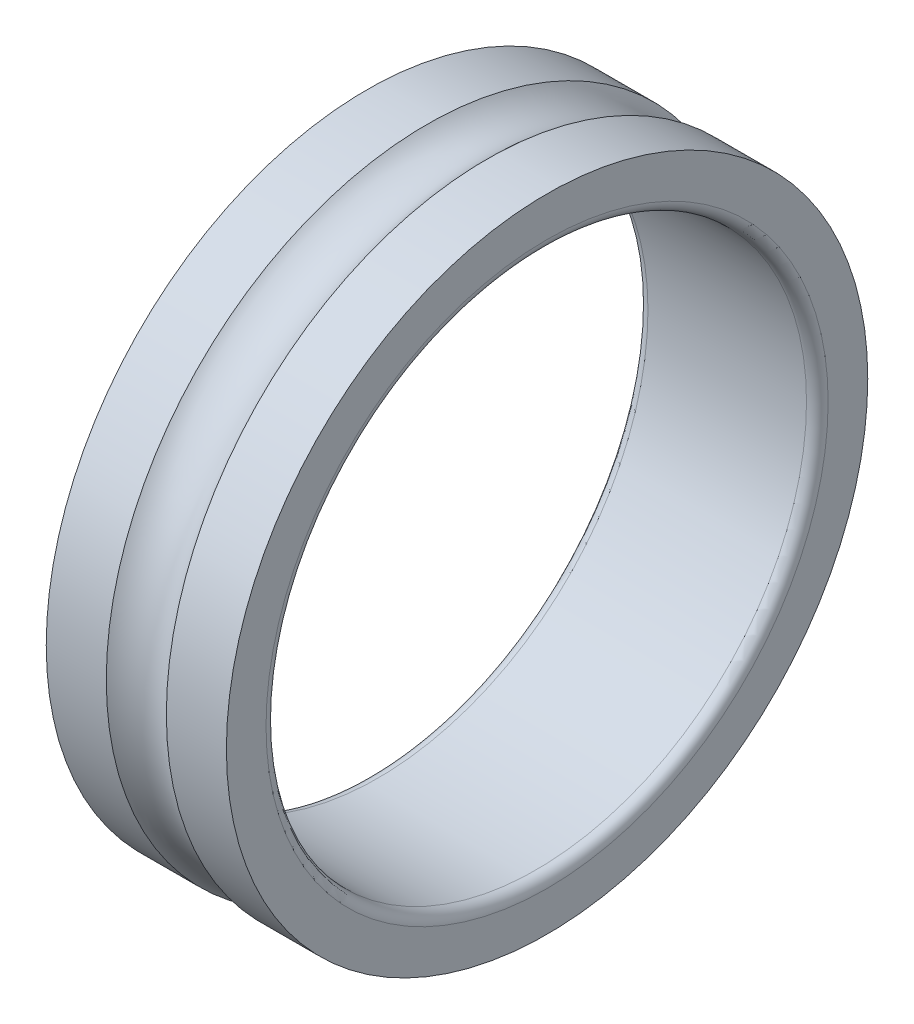
ISO-10303-21;
HEADER;
FILE_DESCRIPTION(('STEP AP214'),'2;1');
FILE_NAME('part.step','',(''),(''),'','','');
FILE_SCHEMA(('AUTOMOTIVE_DESIGN { 1 0 10303 214 1 1 1 1 }'));
ENDSEC;
DATA;
#1=APPLICATION_CONTEXT('core data for automotive mechanical design processes');
#2=APPLICATION_PROTOCOL_DEFINITION('international standard','automotive_design',2000,#1);
#3=PRODUCT_CONTEXT('',#1,'mechanical');
#4=PRODUCT('Part','Part','',(#3));
#5=PRODUCT_RELATED_PRODUCT_CATEGORY('part','',(#4));
#6=PRODUCT_DEFINITION_FORMATION('','',#4);
#7=PRODUCT_DEFINITION_CONTEXT('part definition',#1,'design');
#8=PRODUCT_DEFINITION('design','',#6,#7);
#9=PRODUCT_DEFINITION_SHAPE('','',#8);
#10=(LENGTH_UNIT() NAMED_UNIT(*) SI_UNIT(.MILLI.,.METRE.));
#11=(NAMED_UNIT(*) PLANE_ANGLE_UNIT() SI_UNIT($,.RADIAN.));
#12=(NAMED_UNIT(*) SI_UNIT($,.STERADIAN.) SOLID_ANGLE_UNIT());
#13=UNCERTAINTY_MEASURE_WITH_UNIT(LENGTH_MEASURE(1.E-05),#10,'distance_accuracy_value','');
#14=(GEOMETRIC_REPRESENTATION_CONTEXT(3) GLOBAL_UNCERTAINTY_ASSIGNED_CONTEXT((#13)) GLOBAL_UNIT_ASSIGNED_CONTEXT((#10,
#11,#12)) REPRESENTATION_CONTEXT('',''));
#15=CARTESIAN_POINT('',(0.,0.,0.));
#16=DIRECTION('',(0.,0.,1.));
#17=DIRECTION('',(1.,0.,0.));
#18=AXIS2_PLACEMENT_3D('',#15,#16,#17);
#19=CARTESIAN_POINT('',(0.299999999999939,0.,0.));
#20=DIRECTION('',(-1.,0.,0.));
#21=DIRECTION('',(0.,0.,1.));
#22=AXIS2_PLACEMENT_3D('',#19,#20,#21);
#23=TOROIDAL_SURFACE('',#22,7.79999999999994,0.299999999999939);
#24=CARTESIAN_POINT('',(0.300000000000002,0.,0.));
#25=DIRECTION('',(-1.,0.,0.));
#26=DIRECTION('',(0.,0.,1.));
#27=AXIS2_PLACEMENT_3D('',#24,#25,#26);
#28=CIRCLE('',#27,7.5);
#29=CARTESIAN_POINT('',(0.300000000000002,0.,7.5));
#30=VERTEX_POINT('',#29);
#31=EDGE_CURVE('E10',#30,#30,#28,.T.);
#32=ORIENTED_EDGE('',*,*,#31,.F.);
#33=EDGE_LOOP('',(#32));
#34=FACE_BOUND('',#33,.T.);
#35=CARTESIAN_POINT('',(0.,0.,0.));
#36=DIRECTION('',(-1.,0.,0.));
#37=DIRECTION('',(0.,0.,1.));
#38=AXIS2_PLACEMENT_3D('',#35,#36,#37);
#39=CIRCLE('',#38,7.8);
#40=CARTESIAN_POINT('',(0.,0.,7.8));
#41=VERTEX_POINT('',#40);
#42=EDGE_CURVE('E63',#41,#41,#39,.T.);
#43=ORIENTED_EDGE('',*,*,#42,.T.);
#44=EDGE_LOOP('',(#43));
#45=FACE_BOUND('',#44,.T.);
#46=ADVANCED_FACE('F35',(#34,#45),#23,.T.);
#47=CARTESIAN_POINT('',(50.,0.,0.));
#48=DIRECTION('',(-1.,0.,0.));
#49=DIRECTION('',(0.,0.,1.));
#50=AXIS2_PLACEMENT_3D('',#47,#48,#49);
#51=CYLINDRICAL_SURFACE('',#50,7.5);
#52=CARTESIAN_POINT('',(4.7,0.,0.));
#53=DIRECTION('',(-1.,0.,0.));
#54=DIRECTION('',(0.,0.,1.));
#55=AXIS2_PLACEMENT_3D('',#52,#53,#54);
#56=CIRCLE('',#55,7.5);
#57=CARTESIAN_POINT('',(4.7,0.,7.5));
#58=VERTEX_POINT('',#57);
#59=EDGE_CURVE('E41',#58,#58,#56,.T.);
#60=ORIENTED_EDGE('',*,*,#59,.F.);
#61=EDGE_LOOP('',(#60));
#62=FACE_BOUND('',#61,.T.);
#63=ORIENTED_EDGE('',*,*,#31,.T.);
#64=EDGE_LOOP('',(#63));
#65=FACE_BOUND('',#64,.T.);
#66=ADVANCED_FACE('F100',(#62,#65),#51,.F.);
#67=CARTESIAN_POINT('',(4.70000000000012,0.,0.));
#68=DIRECTION('',(-1.,0.,0.));
#69=DIRECTION('',(0.,0.,1.));
#70=AXIS2_PLACEMENT_3D('',#67,#68,#69);
#71=TOROIDAL_SURFACE('',#70,7.79999999999988,0.299999999999877);
#72=CARTESIAN_POINT('',(5.,0.,0.));
#73=DIRECTION('',(-1.,0.,0.));
#74=DIRECTION('',(0.,0.,1.));
#75=AXIS2_PLACEMENT_3D('',#72,#73,#74);
#76=CIRCLE('',#75,7.80000000000012);
#77=CARTESIAN_POINT('',(5.,0.,7.80000000000012));
#78=VERTEX_POINT('',#77);
#79=EDGE_CURVE('E45',#78,#78,#76,.T.);
#80=ORIENTED_EDGE('',*,*,#79,.F.);
#81=EDGE_LOOP('',(#80));
#82=FACE_BOUND('',#81,.T.);
#83=ORIENTED_EDGE('',*,*,#59,.T.);
#84=EDGE_LOOP('',(#83));
#85=FACE_BOUND('',#84,.T.);
#86=ADVANCED_FACE('F95',(#82,#85),#71,.T.);
#87=CARTESIAN_POINT('',(5.,7.80000000000012,0.));
#88=DIRECTION('',(-1.,0.,0.));
#89=DIRECTION('',(0.,0.,1.));
#90=AXIS2_PLACEMENT_3D('',#87,#88,#89);
#91=PLANE('',#90);
#92=CARTESIAN_POINT('',(5.,0.,0.));
#93=DIRECTION('',(-1.,0.,0.));
#94=DIRECTION('',(0.,0.,1.));
#95=AXIS2_PLACEMENT_3D('',#92,#93,#94);
#96=CIRCLE('',#95,8.9);
#97=CARTESIAN_POINT('',(5.,0.,8.9));
#98=VERTEX_POINT('',#97);
#99=EDGE_CURVE('E49',#98,#98,#96,.T.);
#100=ORIENTED_EDGE('',*,*,#99,.F.);
#101=EDGE_LOOP('',(#100));
#102=FACE_BOUND('',#101,.T.);
#103=ORIENTED_EDGE('',*,*,#79,.T.);
#104=EDGE_LOOP('',(#103));
#105=FACE_BOUND('',#104,.T.);
#106=ADVANCED_FACE('F89',(#102,#105),#91,.F.);
#107=CARTESIAN_POINT('',(50.,0.,0.));
#108=DIRECTION('',(-1.,0.,0.));
#109=DIRECTION('',(0.,0.,1.));
#110=AXIS2_PLACEMENT_3D('',#107,#108,#109);
#111=CYLINDRICAL_SURFACE('',#110,8.9);
#112=CARTESIAN_POINT('',(3.3335407908435,0.,0.));
#113=DIRECTION('',(-1.,0.,0.));
#114=DIRECTION('',(0.,0.,1.));
#115=AXIS2_PLACEMENT_3D('',#112,#113,#114);
#116=CIRCLE('',#115,8.9);
#117=CARTESIAN_POINT('',(3.3335407908435,0.,8.9));
#118=VERTEX_POINT('',#117);
#119=EDGE_CURVE('E54',#118,#118,#116,.T.);
#120=ORIENTED_EDGE('',*,*,#119,.F.);
#121=EDGE_LOOP('',(#120));
#122=FACE_BOUND('',#121,.T.);
#123=ORIENTED_EDGE('',*,*,#99,.T.);
#124=EDGE_LOOP('',(#123));
#125=FACE_BOUND('',#124,.T.);
#126=ADVANCED_FACE('F83',(#122,#125),#111,.T.);
#127=CARTESIAN_POINT('',(2.5,0.,0.));
#128=DIRECTION('',(-1.,0.,0.));
#129=DIRECTION('',(0.,0.,1.));
#130=AXIS2_PLACEMENT_3D('',#127,#128,#129);
#131=TOROIDAL_SURFACE('',#130,9.75000000000001,1.19050000000001);
#132=CARTESIAN_POINT('',(1.6664592091565,0.,0.));
#133=DIRECTION('',(-1.,0.,0.));
#134=DIRECTION('',(0.,0.,1.));
#135=AXIS2_PLACEMENT_3D('',#132,#133,#134);
#136=CIRCLE('',#135,8.9);
#137=CARTESIAN_POINT('',(1.6664592091565,0.,8.9));
#138=VERTEX_POINT('',#137);
#139=EDGE_CURVE('E57',#138,#138,#136,.T.);
#140=ORIENTED_EDGE('',*,*,#139,.F.);
#141=EDGE_LOOP('',(#140));
#142=FACE_BOUND('',#141,.T.);
#143=ORIENTED_EDGE('',*,*,#119,.T.);
#144=EDGE_LOOP('',(#143));
#145=FACE_BOUND('',#144,.T.);
#146=ADVANCED_FACE('F77',(#142,#145),#131,.F.);
#147=CARTESIAN_POINT('',(50.,0.,0.));
#148=DIRECTION('',(-1.,0.,0.));
#149=DIRECTION('',(0.,0.,1.));
#150=AXIS2_PLACEMENT_3D('',#147,#148,#149);
#151=CYLINDRICAL_SURFACE('',#150,8.9);
#152=CARTESIAN_POINT('',(0.,0.,0.));
#153=DIRECTION('',(-1.,0.,0.));
#154=DIRECTION('',(0.,0.,1.));
#155=AXIS2_PLACEMENT_3D('',#152,#153,#154);
#156=CIRCLE('',#155,8.9);
#157=CARTESIAN_POINT('',(0.,0.,8.9));
#158=VERTEX_POINT('',#157);
#159=EDGE_CURVE('E60',#158,#158,#156,.T.);
#160=ORIENTED_EDGE('',*,*,#159,.F.);
#161=EDGE_LOOP('',(#160));
#162=FACE_BOUND('',#161,.T.);
#163=ORIENTED_EDGE('',*,*,#139,.T.);
#164=EDGE_LOOP('',(#163));
#165=FACE_BOUND('',#164,.T.);
#166=ADVANCED_FACE('F71',(#162,#165),#151,.T.);
#167=CARTESIAN_POINT('',(0.,8.9,0.));
#168=DIRECTION('',(1.,0.,0.));
#169=DIRECTION('',(0.,0.,-1.));
#170=AXIS2_PLACEMENT_3D('',#167,#168,#169);
#171=PLANE('',#170);
#172=ORIENTED_EDGE('',*,*,#42,.F.);
#173=EDGE_LOOP('',(#172));
#174=FACE_BOUND('',#173,.T.);
#175=ORIENTED_EDGE('',*,*,#159,.T.);
#176=EDGE_LOOP('',(#175));
#177=FACE_BOUND('',#176,.T.);
#178=ADVANCED_FACE('F68',(#174,#177),#171,.F.);
#179=CLOSED_SHELL('',(#46,#66,#86,#106,#126,#146,#166,#178));
#180=MANIFOLD_SOLID_BREP('B2',#179);
#181=ADVANCED_BREP_SHAPE_REPRESENTATION('',(#18,#180),#14);
#182=SHAPE_DEFINITION_REPRESENTATION(#9,#181);
ENDSEC;
END-ISO-10303-21;
